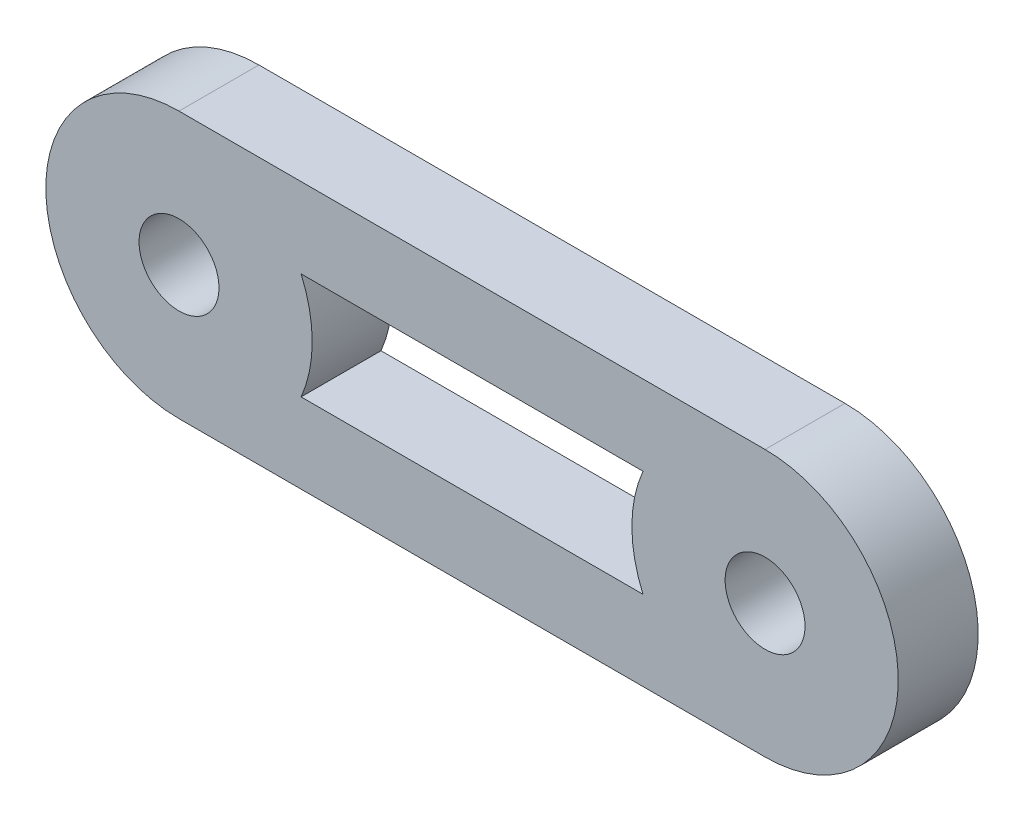
ISO-10303-21;
HEADER;
FILE_DESCRIPTION(('STEP AP214'),'2;1');
FILE_NAME('part.step','',(''),(''),'','','');
FILE_SCHEMA(('AUTOMOTIVE_DESIGN { 1 0 10303 214 1 1 1 1 }'));
ENDSEC;
DATA;
#1=APPLICATION_CONTEXT('core data for automotive mechanical design processes');
#2=APPLICATION_PROTOCOL_DEFINITION('international standard','automotive_design',2000,#1);
#3=PRODUCT_CONTEXT('',#1,'mechanical');
#4=PRODUCT('Part','Part','',(#3));
#5=PRODUCT_RELATED_PRODUCT_CATEGORY('part','',(#4));
#6=PRODUCT_DEFINITION_FORMATION('','',#4);
#7=PRODUCT_DEFINITION_CONTEXT('part definition',#1,'design');
#8=PRODUCT_DEFINITION('design','',#6,#7);
#9=PRODUCT_DEFINITION_SHAPE('','',#8);
#10=(LENGTH_UNIT() NAMED_UNIT(*) SI_UNIT(.MILLI.,.METRE.));
#11=(NAMED_UNIT(*) PLANE_ANGLE_UNIT() SI_UNIT($,.RADIAN.));
#12=(NAMED_UNIT(*) SI_UNIT($,.STERADIAN.) SOLID_ANGLE_UNIT());
#13=UNCERTAINTY_MEASURE_WITH_UNIT(LENGTH_MEASURE(1.E-05),#10,'distance_accuracy_value','');
#14=(GEOMETRIC_REPRESENTATION_CONTEXT(3) GLOBAL_UNCERTAINTY_ASSIGNED_CONTEXT((#13)) GLOBAL_UNIT_ASSIGNED_CONTEXT((#10,
#11,#12)) REPRESENTATION_CONTEXT('',''));
#15=CARTESIAN_POINT('',(0.,0.,0.));
#16=DIRECTION('',(0.,0.,1.));
#17=DIRECTION('',(1.,0.,0.));
#18=AXIS2_PLACEMENT_3D('',#15,#16,#17);
#19=CARTESIAN_POINT('',(11.,-5.,3.));
#20=DIRECTION('',(0.,1.,0.));
#21=DIRECTION('',(0.,0.,1.));
#22=AXIS2_PLACEMENT_3D('',#19,#20,#21);
#23=PLANE('',#22);
#24=DIRECTION('',(1.,0.,0.));
#25=VECTOR('',#24,1.);
#26=CARTESIAN_POINT('',(11.,-5.,0.));
#27=LINE('',#26,#25);
#28=CARTESIAN_POINT('',(0.,-5.,0.));
#29=VERTEX_POINT('',#28);
#30=CARTESIAN_POINT('',(22.,-5.,0.));
#31=VERTEX_POINT('',#30);
#32=EDGE_CURVE('E150',#29,#31,#27,.T.);
#33=ORIENTED_EDGE('',*,*,#32,.T.);
#34=DIRECTION('',(0.,0.,-1.));
#35=VECTOR('',#34,1.);
#36=CARTESIAN_POINT('',(22.,-5.,3.));
#37=LINE('',#36,#35);
#38=CARTESIAN_POINT('',(22.,-5.,3.));
#39=VERTEX_POINT('',#38);
#40=EDGE_CURVE('E166',#39,#31,#37,.T.);
#41=ORIENTED_EDGE('',*,*,#40,.F.);
#42=DIRECTION('',(1.,0.,0.));
#43=VECTOR('',#42,1.);
#44=CARTESIAN_POINT('',(11.,-5.,3.));
#45=LINE('',#44,#43);
#46=CARTESIAN_POINT('',(0.,-5.,3.));
#47=VERTEX_POINT('',#46);
#48=EDGE_CURVE('E133',#47,#39,#45,.T.);
#49=ORIENTED_EDGE('',*,*,#48,.F.);
#50=DIRECTION('',(0.,0.,-1.));
#51=VECTOR('',#50,1.);
#52=CARTESIAN_POINT('',(0.,-5.,3.));
#53=LINE('',#52,#51);
#54=EDGE_CURVE('E144',#47,#29,#53,.T.);
#55=ORIENTED_EDGE('',*,*,#54,.T.);
#56=EDGE_LOOP('',(#33,#41,#49,#55));
#57=FACE_BOUND('',#56,.T.);
#58=ADVANCED_FACE('F32',(#57),#23,.F.);
#59=CARTESIAN_POINT('',(22.,0.,3.));
#60=DIRECTION('',(0.,0.,-1.));
#61=DIRECTION('',(-1.,0.,0.));
#62=AXIS2_PLACEMENT_3D('',#59,#60,#61);
#63=CYLINDRICAL_SURFACE('',#62,5.);
#64=CARTESIAN_POINT('',(22.,0.,0.));
#65=DIRECTION('',(0.,0.,1.));
#66=DIRECTION('',(1.,0.,0.));
#67=AXIS2_PLACEMENT_3D('',#64,#65,#66);
#68=CIRCLE('',#67,5.);
#69=CARTESIAN_POINT('',(22.,5.,0.));
#70=VERTEX_POINT('',#69);
#71=EDGE_CURVE('E153',#31,#70,#68,.T.);
#72=ORIENTED_EDGE('',*,*,#71,.T.);
#73=DIRECTION('',(0.,0.,-1.));
#74=VECTOR('',#73,1.);
#75=CARTESIAN_POINT('',(22.,5.,3.));
#76=LINE('',#75,#74);
#77=CARTESIAN_POINT('',(22.,5.,3.));
#78=VERTEX_POINT('',#77);
#79=EDGE_CURVE('E164',#78,#70,#76,.T.);
#80=ORIENTED_EDGE('',*,*,#79,.F.);
#81=CARTESIAN_POINT('',(22.,0.,3.));
#82=DIRECTION('',(0.,0.,1.));
#83=DIRECTION('',(1.,0.,0.));
#84=AXIS2_PLACEMENT_3D('',#81,#82,#83);
#85=CIRCLE('',#84,5.);
#86=EDGE_CURVE('E136',#39,#78,#85,.T.);
#87=ORIENTED_EDGE('',*,*,#86,.F.);
#88=ORIENTED_EDGE('',*,*,#40,.T.);
#89=EDGE_LOOP('',(#72,#80,#87,#88));
#90=FACE_BOUND('',#89,.T.);
#91=ADVANCED_FACE('F190',(#90),#63,.T.);
#92=CARTESIAN_POINT('',(11.,5.,3.));
#93=DIRECTION('',(0.,1.,0.));
#94=DIRECTION('',(0.,0.,1.));
#95=AXIS2_PLACEMENT_3D('',#92,#93,#94);
#96=PLANE('',#95);
#97=DIRECTION('',(1.,0.,0.));
#98=VECTOR('',#97,1.);
#99=CARTESIAN_POINT('',(11.,5.,0.));
#100=LINE('',#99,#98);
#101=CARTESIAN_POINT('',(0.,5.,0.));
#102=VERTEX_POINT('',#101);
#103=EDGE_CURVE('E156',#102,#70,#100,.T.);
#104=ORIENTED_EDGE('',*,*,#103,.F.);
#105=DIRECTION('',(0.,0.,-1.));
#106=VECTOR('',#105,1.);
#107=CARTESIAN_POINT('',(0.,5.,3.));
#108=LINE('',#107,#106);
#109=CARTESIAN_POINT('',(0.,5.,3.));
#110=VERTEX_POINT('',#109);
#111=EDGE_CURVE('E162',#110,#102,#108,.T.);
#112=ORIENTED_EDGE('',*,*,#111,.F.);
#113=DIRECTION('',(1.,0.,0.));
#114=VECTOR('',#113,1.);
#115=CARTESIAN_POINT('',(11.,5.,3.));
#116=LINE('',#115,#114);
#117=EDGE_CURVE('E138',#110,#78,#116,.T.);
#118=ORIENTED_EDGE('',*,*,#117,.T.);
#119=ORIENTED_EDGE('',*,*,#79,.T.);
#120=EDGE_LOOP('',(#104,#112,#118,#119));
#121=FACE_BOUND('',#120,.T.);
#122=ADVANCED_FACE('F196',(#121),#96,.T.);
#123=CARTESIAN_POINT('',(0.,0.,3.));
#124=DIRECTION('',(0.,0.,-1.));
#125=DIRECTION('',(-1.,0.,0.));
#126=AXIS2_PLACEMENT_3D('',#123,#124,#125);
#127=CYLINDRICAL_SURFACE('',#126,1.5);
#128=CARTESIAN_POINT('',(0.,0.,3.));
#129=DIRECTION('',(0.,0.,1.));
#130=DIRECTION('',(1.,0.,0.));
#131=AXIS2_PLACEMENT_3D('',#128,#129,#130);
#132=CIRCLE('',#131,1.5);
#133=CARTESIAN_POINT('',(1.5,0.,3.));
#134=VERTEX_POINT('',#133);
#135=EDGE_CURVE('E129',#134,#134,#132,.T.);
#136=ORIENTED_EDGE('',*,*,#135,.T.);
#137=EDGE_LOOP('',(#136));
#138=FACE_BOUND('',#137,.T.);
#139=CARTESIAN_POINT('',(0.,0.,0.));
#140=DIRECTION('',(0.,0.,1.));
#141=DIRECTION('',(1.,0.,0.));
#142=AXIS2_PLACEMENT_3D('',#139,#140,#141);
#143=CIRCLE('',#142,1.5);
#144=CARTESIAN_POINT('',(1.5,0.,0.));
#145=VERTEX_POINT('',#144);
#146=EDGE_CURVE('E147',#145,#145,#143,.T.);
#147=ORIENTED_EDGE('',*,*,#146,.F.);
#148=EDGE_LOOP('',(#147));
#149=FACE_BOUND('',#148,.T.);
#150=ADVANCED_FACE('F200',(#138,#149),#127,.F.);
#151=CARTESIAN_POINT('',(22.,0.,3.));
#152=DIRECTION('',(0.,0.,-1.));
#153=DIRECTION('',(-1.,0.,0.));
#154=AXIS2_PLACEMENT_3D('',#151,#152,#153);
#155=CYLINDRICAL_SURFACE('',#154,1.5);
#156=CARTESIAN_POINT('',(22.,0.,3.));
#157=DIRECTION('',(0.,0.,1.));
#158=DIRECTION('',(1.,0.,0.));
#159=AXIS2_PLACEMENT_3D('',#156,#157,#158);
#160=CIRCLE('',#159,1.5);
#161=CARTESIAN_POINT('',(23.5,0.,3.));
#162=VERTEX_POINT('',#161);
#163=EDGE_CURVE('E126',#162,#162,#160,.T.);
#164=ORIENTED_EDGE('',*,*,#163,.T.);
#165=EDGE_LOOP('',(#164));
#166=FACE_BOUND('',#165,.T.);
#167=CARTESIAN_POINT('',(22.,0.,0.));
#168=DIRECTION('',(0.,0.,1.));
#169=DIRECTION('',(1.,0.,0.));
#170=AXIS2_PLACEMENT_3D('',#167,#168,#169);
#171=CIRCLE('',#170,1.5);
#172=CARTESIAN_POINT('',(23.5,0.,0.));
#173=VERTEX_POINT('',#172);
#174=EDGE_CURVE('E123',#173,#173,#171,.T.);
#175=ORIENTED_EDGE('',*,*,#174,.F.);
#176=EDGE_LOOP('',(#175));
#177=FACE_BOUND('',#176,.T.);
#178=ADVANCED_FACE('F34',(#166,#177),#155,.F.);
#179=CARTESIAN_POINT('',(0.,0.,3.));
#180=DIRECTION('',(0.,0.,-1.));
#181=DIRECTION('',(-1.,0.,0.));
#182=AXIS2_PLACEMENT_3D('',#179,#180,#181);
#183=CYLINDRICAL_SURFACE('',#182,5.);
#184=CARTESIAN_POINT('',(0.,0.,0.));
#185=DIRECTION('',(0.,0.,1.));
#186=DIRECTION('',(1.,0.,0.));
#187=AXIS2_PLACEMENT_3D('',#184,#185,#186);
#188=CIRCLE('',#187,5.);
#189=EDGE_CURVE('E130',#29,#102,#188,.F.);
#190=ORIENTED_EDGE('',*,*,#189,.F.);
#191=ORIENTED_EDGE('',*,*,#54,.F.);
#192=CARTESIAN_POINT('',(0.,0.,3.));
#193=DIRECTION('',(0.,0.,1.));
#194=DIRECTION('',(1.,0.,0.));
#195=AXIS2_PLACEMENT_3D('',#192,#193,#194);
#196=CIRCLE('',#195,5.);
#197=EDGE_CURVE('E141',#47,#110,#196,.F.);
#198=ORIENTED_EDGE('',*,*,#197,.T.);
#199=ORIENTED_EDGE('',*,*,#111,.T.);
#200=EDGE_LOOP('',(#190,#191,#198,#199));
#201=FACE_BOUND('',#200,.T.);
#202=ADVANCED_FACE('F207',(#201),#183,.T.);
#203=CARTESIAN_POINT('',(11.,-26.2186144567226,3.));
#204=DIRECTION('',(0.,0.,1.));
#205=DIRECTION('',(1.,0.,0.));
#206=AXIS2_PLACEMENT_3D('',#203,#204,#205);
#207=PLANE('',#206);
#208=CARTESIAN_POINT('',(22.,0.,3.));
#209=DIRECTION('',(0.,0.,-1.));
#210=DIRECTION('',(1.,0.,0.));
#211=AXIS2_PLACEMENT_3D('',#208,#209,#210);
#212=CIRCLE('',#211,5.);
#213=CARTESIAN_POINT('',(17.4174243050442,-2.,3.));
#214=VERTEX_POINT('',#213);
#215=CARTESIAN_POINT('',(17.4174243050442,2.,3.));
#216=VERTEX_POINT('',#215);
#217=EDGE_CURVE('E47',#214,#216,#212,.T.);
#218=ORIENTED_EDGE('',*,*,#217,.F.);
#219=DIRECTION('',(1.,0.,0.));
#220=VECTOR('',#219,1.);
#221=CARTESIAN_POINT('',(4.58257569495584,-2.,3.));
#222=LINE('',#221,#220);
#223=CARTESIAN_POINT('',(4.58257569495584,-2.,3.));
#224=VERTEX_POINT('',#223);
#225=EDGE_CURVE('E116',#224,#214,#222,.T.);
#226=ORIENTED_EDGE('',*,*,#225,.F.);
#227=CARTESIAN_POINT('',(0.,0.,3.));
#228=DIRECTION('',(0.,0.,-1.));
#229=DIRECTION('',(1.,0.,0.));
#230=AXIS2_PLACEMENT_3D('',#227,#228,#229);
#231=CIRCLE('',#230,5.);
#232=CARTESIAN_POINT('',(4.58257569495584,2.,3.));
#233=VERTEX_POINT('',#232);
#234=EDGE_CURVE('E100',#233,#224,#231,.T.);
#235=ORIENTED_EDGE('',*,*,#234,.F.);
#236=DIRECTION('',(-1.,0.,0.));
#237=VECTOR('',#236,1.);
#238=CARTESIAN_POINT('',(17.4174243050442,2.,3.));
#239=LINE('',#238,#237);
#240=EDGE_CURVE('E109',#216,#233,#239,.T.);
#241=ORIENTED_EDGE('',*,*,#240,.F.);
#242=EDGE_LOOP('',(#218,#226,#235,#241));
#243=FACE_BOUND('',#242,.T.);
#244=ORIENTED_EDGE('',*,*,#163,.F.);
#245=EDGE_LOOP('',(#244));
#246=FACE_BOUND('',#245,.T.);
#247=ORIENTED_EDGE('',*,*,#135,.F.);
#248=EDGE_LOOP('',(#247));
#249=FACE_BOUND('',#248,.T.);
#250=ORIENTED_EDGE('',*,*,#48,.T.);
#251=ORIENTED_EDGE('',*,*,#86,.T.);
#252=ORIENTED_EDGE('',*,*,#117,.F.);
#253=ORIENTED_EDGE('',*,*,#197,.F.);
#254=EDGE_LOOP('',(#250,#251,#252,#253));
#255=FACE_BOUND('',#254,.T.);
#256=ADVANCED_FACE('F113',(#243,#246,#249,#255),#207,.T.);
#257=CARTESIAN_POINT('',(11.,-26.2186144567226,0.));
#258=DIRECTION('',(0.,0.,1.));
#259=DIRECTION('',(1.,0.,0.));
#260=AXIS2_PLACEMENT_3D('',#257,#258,#259);
#261=PLANE('',#260);
#262=DIRECTION('',(1.,0.,0.));
#263=VECTOR('',#262,1.);
#264=CARTESIAN_POINT('',(11.,-2.,0.));
#265=LINE('',#264,#263);
#266=CARTESIAN_POINT('',(4.58257569495584,-2.,0.));
#267=VERTEX_POINT('',#266);
#268=CARTESIAN_POINT('',(17.4174243050442,-2.,0.));
#269=VERTEX_POINT('',#268);
#270=EDGE_CURVE('E40',#267,#269,#265,.T.);
#271=ORIENTED_EDGE('',*,*,#270,.T.);
#272=CARTESIAN_POINT('',(22.,0.,0.));
#273=DIRECTION('',(0.,0.,1.));
#274=DIRECTION('',(1.,0.,0.));
#275=AXIS2_PLACEMENT_3D('',#272,#273,#274);
#276=CIRCLE('',#275,5.);
#277=CARTESIAN_POINT('',(17.4174243050442,2.,0.));
#278=VERTEX_POINT('',#277);
#279=EDGE_CURVE('E11',#269,#278,#276,.F.);
#280=ORIENTED_EDGE('',*,*,#279,.T.);
#281=DIRECTION('',(-1.,0.,0.));
#282=VECTOR('',#281,1.);
#283=CARTESIAN_POINT('',(11.,2.,0.));
#284=LINE('',#283,#282);
#285=CARTESIAN_POINT('',(4.58257569495584,2.,0.));
#286=VERTEX_POINT('',#285);
#287=EDGE_CURVE('E169',#278,#286,#284,.T.);
#288=ORIENTED_EDGE('',*,*,#287,.T.);
#289=CARTESIAN_POINT('',(0.,0.,0.));
#290=DIRECTION('',(0.,0.,1.));
#291=DIRECTION('',(1.,0.,0.));
#292=AXIS2_PLACEMENT_3D('',#289,#290,#291);
#293=CIRCLE('',#292,5.);
#294=EDGE_CURVE('E103',#286,#267,#293,.F.);
#295=ORIENTED_EDGE('',*,*,#294,.T.);
#296=EDGE_LOOP('',(#271,#280,#288,#295));
#297=FACE_BOUND('',#296,.T.);
#298=ORIENTED_EDGE('',*,*,#174,.T.);
#299=EDGE_LOOP('',(#298));
#300=FACE_BOUND('',#299,.T.);
#301=ORIENTED_EDGE('',*,*,#146,.T.);
#302=EDGE_LOOP('',(#301));
#303=FACE_BOUND('',#302,.T.);
#304=ORIENTED_EDGE('',*,*,#32,.F.);
#305=ORIENTED_EDGE('',*,*,#189,.T.);
#306=ORIENTED_EDGE('',*,*,#103,.T.);
#307=ORIENTED_EDGE('',*,*,#71,.F.);
#308=EDGE_LOOP('',(#304,#305,#306,#307));
#309=FACE_BOUND('',#308,.T.);
#310=ADVANCED_FACE('F173',(#297,#300,#303,#309),#261,.F.);
#311=CARTESIAN_POINT('',(22.,0.,-7.));
#312=DIRECTION('',(0.,0.,1.));
#313=DIRECTION('',(1.,0.,0.));
#314=AXIS2_PLACEMENT_3D('',#311,#312,#313);
#315=CYLINDRICAL_SURFACE('',#314,5.);
#316=DIRECTION('',(0.,0.,1.));
#317=VECTOR('',#316,1.);
#318=CARTESIAN_POINT('',(17.4174243050442,-2.,-7.));
#319=LINE('',#318,#317);
#320=EDGE_CURVE('E121',#269,#214,#319,.T.);
#321=ORIENTED_EDGE('',*,*,#320,.T.);
#322=ORIENTED_EDGE('',*,*,#217,.T.);
#323=DIRECTION('',(0.,0.,1.));
#324=VECTOR('',#323,1.);
#325=CARTESIAN_POINT('',(17.4174243050442,2.,-7.));
#326=LINE('',#325,#324);
#327=EDGE_CURVE('E106',#278,#216,#326,.T.);
#328=ORIENTED_EDGE('',*,*,#327,.F.);
#329=ORIENTED_EDGE('',*,*,#279,.F.);
#330=EDGE_LOOP('',(#321,#322,#328,#329));
#331=FACE_BOUND('',#330,.T.);
#332=ADVANCED_FACE('F178',(#331),#315,.T.);
#333=CARTESIAN_POINT('',(4.58257569495584,-2.,-7.));
#334=DIRECTION('',(0.,-1.,0.));
#335=DIRECTION('',(0.,0.,-1.));
#336=AXIS2_PLACEMENT_3D('',#333,#334,#335);
#337=PLANE('',#336);
#338=DIRECTION('',(0.,0.,1.));
#339=VECTOR('',#338,1.);
#340=CARTESIAN_POINT('',(4.58257569495584,-2.,-7.));
#341=LINE('',#340,#339);
#342=EDGE_CURVE('E105',#267,#224,#341,.T.);
#343=ORIENTED_EDGE('',*,*,#342,.T.);
#344=ORIENTED_EDGE('',*,*,#225,.T.);
#345=ORIENTED_EDGE('',*,*,#320,.F.);
#346=ORIENTED_EDGE('',*,*,#270,.F.);
#347=EDGE_LOOP('',(#343,#344,#345,#346));
#348=FACE_BOUND('',#347,.T.);
#349=ADVANCED_FACE('F177',(#348),#337,.F.);
#350=CARTESIAN_POINT('',(0.,0.,-7.));
#351=DIRECTION('',(0.,0.,1.));
#352=DIRECTION('',(1.,0.,0.));
#353=AXIS2_PLACEMENT_3D('',#350,#351,#352);
#354=CYLINDRICAL_SURFACE('',#353,5.);
#355=DIRECTION('',(0.,0.,1.));
#356=VECTOR('',#355,1.);
#357=CARTESIAN_POINT('',(4.58257569495584,2.,-7.));
#358=LINE('',#357,#356);
#359=EDGE_CURVE('E55',#286,#233,#358,.T.);
#360=ORIENTED_EDGE('',*,*,#359,.T.);
#361=ORIENTED_EDGE('',*,*,#234,.T.);
#362=ORIENTED_EDGE('',*,*,#342,.F.);
#363=ORIENTED_EDGE('',*,*,#294,.F.);
#364=EDGE_LOOP('',(#360,#361,#362,#363));
#365=FACE_BOUND('',#364,.T.);
#366=ADVANCED_FACE('F97',(#365),#354,.T.);
#367=CARTESIAN_POINT('',(17.4174243050442,2.,-7.));
#368=DIRECTION('',(0.,1.,0.));
#369=DIRECTION('',(0.,0.,1.));
#370=AXIS2_PLACEMENT_3D('',#367,#368,#369);
#371=PLANE('',#370);
#372=ORIENTED_EDGE('',*,*,#327,.T.);
#373=ORIENTED_EDGE('',*,*,#240,.T.);
#374=ORIENTED_EDGE('',*,*,#359,.F.);
#375=ORIENTED_EDGE('',*,*,#287,.F.);
#376=EDGE_LOOP('',(#372,#373,#374,#375));
#377=FACE_BOUND('',#376,.T.);
#378=ADVANCED_FACE('F110',(#377),#371,.F.);
#379=CLOSED_SHELL('',(#58,#91,#122,#150,#178,#202,#256,#310,#332,#349,#366,#378));
#380=MANIFOLD_SOLID_BREP('B2',#379);
#381=ADVANCED_BREP_SHAPE_REPRESENTATION('',(#18,#380),#14);
#382=SHAPE_DEFINITION_REPRESENTATION(#9,#381);
ENDSEC;
END-ISO-10303-21;
